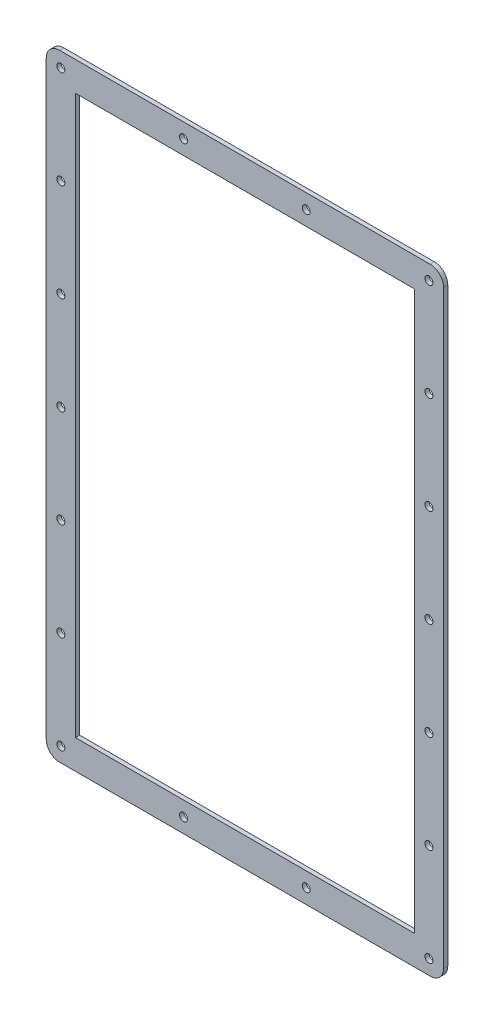
ISO-10303-21;
HEADER;
FILE_DESCRIPTION(('STEP AP214'),'2;1');
FILE_NAME('part.step','',(''),(''),'','','');
FILE_SCHEMA(('AUTOMOTIVE_DESIGN { 1 0 10303 214 1 1 1 1 }'));
ENDSEC;
DATA;
#1=APPLICATION_CONTEXT('core data for automotive mechanical design processes');
#2=APPLICATION_PROTOCOL_DEFINITION('international standard','automotive_design',2000,#1);
#3=PRODUCT_CONTEXT('',#1,'mechanical');
#4=PRODUCT('Part','Part','',(#3));
#5=PRODUCT_RELATED_PRODUCT_CATEGORY('part','',(#4));
#6=PRODUCT_DEFINITION_FORMATION('','',#4);
#7=PRODUCT_DEFINITION_CONTEXT('part definition',#1,'design');
#8=PRODUCT_DEFINITION('design','',#6,#7);
#9=PRODUCT_DEFINITION_SHAPE('','',#8);
#10=(LENGTH_UNIT() NAMED_UNIT(*) SI_UNIT(.MILLI.,.METRE.));
#11=(NAMED_UNIT(*) PLANE_ANGLE_UNIT() SI_UNIT($,.RADIAN.));
#12=(NAMED_UNIT(*) SI_UNIT($,.STERADIAN.) SOLID_ANGLE_UNIT());
#13=UNCERTAINTY_MEASURE_WITH_UNIT(LENGTH_MEASURE(1.E-05),#10,'distance_accuracy_value','');
#14=(GEOMETRIC_REPRESENTATION_CONTEXT(3) GLOBAL_UNCERTAINTY_ASSIGNED_CONTEXT((#13)) GLOBAL_UNIT_ASSIGNED_CONTEXT((#10,
#11,#12)) REPRESENTATION_CONTEXT('',''));
#15=CARTESIAN_POINT('',(0.,0.,0.));
#16=DIRECTION('',(0.,0.,1.));
#17=DIRECTION('',(1.,0.,0.));
#18=AXIS2_PLACEMENT_3D('',#15,#16,#17);
#19=CARTESIAN_POINT('',(139.5,222.,3.175));
#20=DIRECTION('',(0.,0.,1.));
#21=DIRECTION('',(1.,0.,0.));
#22=AXIS2_PLACEMENT_3D('',#19,#20,#21);
#23=PLANE('',#22);
#24=CARTESIAN_POINT('',(138.499999999996,-147.33333333332,3.175));
#25=DIRECTION('',(0.,0.,1.));
#26=DIRECTION('',(1.,0.,0.));
#27=AXIS2_PLACEMENT_3D('',#24,#25,#26);
#28=CIRCLE('',#27,2.99999999999999);
#29=CARTESIAN_POINT('',(141.499999999996,-147.33333333332,3.175));
#30=VERTEX_POINT('',#29);
#31=EDGE_CURVE('E419',#30,#30,#28,.T.);
#32=ORIENTED_EDGE('',*,*,#31,.F.);
#33=EDGE_LOOP('',(#32));
#34=FACE_BOUND('',#33,.T.);
#35=CARTESIAN_POINT('',(-46.166666666689,221.000000000004,3.175));
#36=DIRECTION('',(0.,0.,1.));
#37=DIRECTION('',(1.,0.,0.));
#38=AXIS2_PLACEMENT_3D('',#35,#36,#37);
#39=CIRCLE('',#38,3.);
#40=CARTESIAN_POINT('',(-43.166666666689,221.000000000004,3.175));
#41=VERTEX_POINT('',#40);
#42=EDGE_CURVE('E435',#41,#41,#39,.T.);
#43=ORIENTED_EDGE('',*,*,#42,.F.);
#44=EDGE_LOOP('',(#43));
#45=FACE_BOUND('',#44,.T.);
#46=CARTESIAN_POINT('',(-138.500000000016,73.6666666666667,3.175));
#47=DIRECTION('',(0.,0.,1.));
#48=DIRECTION('',(1.,0.,0.));
#49=AXIS2_PLACEMENT_3D('',#46,#47,#48);
#50=CIRCLE('',#49,2.99999999999999);
#51=CARTESIAN_POINT('',(-135.500000000016,73.6666666666667,3.175));
#52=VERTEX_POINT('',#51);
#53=EDGE_CURVE('E451',#52,#52,#50,.T.);
#54=ORIENTED_EDGE('',*,*,#53,.F.);
#55=EDGE_LOOP('',(#54));
#56=FACE_BOUND('',#55,.T.);
#57=CARTESIAN_POINT('',(138.499999999978,221.000000000013,3.175));
#58=DIRECTION('',(0.,0.,1.));
#59=DIRECTION('',(1.,0.,0.));
#60=AXIS2_PLACEMENT_3D('',#57,#58,#59);
#61=CIRCLE('',#60,2.99999999999999);
#62=CARTESIAN_POINT('',(141.499999999978,221.000000000013,3.175));
#63=VERTEX_POINT('',#62);
#64=EDGE_CURVE('E467',#63,#63,#61,.T.);
#65=ORIENTED_EDGE('',*,*,#64,.F.);
#66=EDGE_LOOP('',(#65));
#67=FACE_BOUND('',#66,.T.);
#68=CARTESIAN_POINT('',(138.499999999984,73.66666666668,3.175));
#69=DIRECTION('',(0.,0.,1.));
#70=DIRECTION('',(1.,0.,0.));
#71=AXIS2_PLACEMENT_3D('',#68,#69,#70);
#72=CIRCLE('',#71,2.99999999999999);
#73=CARTESIAN_POINT('',(141.499999999984,73.66666666668,3.175));
#74=VERTEX_POINT('',#73);
#75=EDGE_CURVE('E483',#74,#74,#72,.T.);
#76=ORIENTED_EDGE('',*,*,#75,.F.);
#77=EDGE_LOOP('',(#76));
#78=FACE_BOUND('',#77,.T.);
#79=CARTESIAN_POINT('',(138.499999999992,-73.6666666666533,3.175));
#80=DIRECTION('',(0.,0.,1.));
#81=DIRECTION('',(1.,0.,0.));
#82=AXIS2_PLACEMENT_3D('',#79,#80,#81);
#83=CIRCLE('',#82,2.99999999999999);
#84=CARTESIAN_POINT('',(141.499999999992,-73.6666666666533,3.175));
#85=VERTEX_POINT('',#84);
#86=EDGE_CURVE('E499',#85,#85,#83,.T.);
#87=ORIENTED_EDGE('',*,*,#86,.F.);
#88=EDGE_LOOP('',(#87));
#89=FACE_BOUND('',#88,.T.);
#90=CARTESIAN_POINT('',(-138.500000000008,-73.6666666666666,3.175));
#91=DIRECTION('',(0.,0.,1.));
#92=DIRECTION('',(1.,0.,0.));
#93=AXIS2_PLACEMENT_3D('',#90,#91,#92);
#94=CIRCLE('',#93,2.99999999999999);
#95=CARTESIAN_POINT('',(-135.500000000008,-73.6666666666666,3.175));
#96=VERTEX_POINT('',#95);
#97=EDGE_CURVE('E515',#96,#96,#94,.T.);
#98=ORIENTED_EDGE('',*,*,#97,.F.);
#99=EDGE_LOOP('',(#98));
#100=FACE_BOUND('',#99,.T.);
#101=CARTESIAN_POINT('',(-46.1666666666666,-220.999999999995,3.175));
#102=DIRECTION('',(0.,0.,1.));
#103=DIRECTION('',(1.,0.,0.));
#104=AXIS2_PLACEMENT_3D('',#101,#102,#103);
#105=CIRCLE('',#104,3.);
#106=CARTESIAN_POINT('',(-43.1666666666666,-220.999999999995,3.175));
#107=VERTEX_POINT('',#106);
#108=EDGE_CURVE('E531',#107,#107,#105,.T.);
#109=ORIENTED_EDGE('',*,*,#108,.F.);
#110=EDGE_LOOP('',(#109));
#111=FACE_BOUND('',#110,.T.);
#112=CARTESIAN_POINT('',(138.5,-220.999999999987,3.175));
#113=DIRECTION('',(0.,0.,1.));
#114=DIRECTION('',(1.,0.,0.));
#115=AXIS2_PLACEMENT_3D('',#112,#113,#114);
#116=CIRCLE('',#115,2.99999999999999);
#117=CARTESIAN_POINT('',(141.5,-220.999999999987,3.175));
#118=VERTEX_POINT('',#117);
#119=EDGE_CURVE('E164',#118,#118,#116,.T.);
#120=ORIENTED_EDGE('',*,*,#119,.F.);
#121=EDGE_LOOP('',(#120));
#122=FACE_BOUND('',#121,.T.);
#123=CARTESIAN_POINT('',(139.5,222.,3.175));
#124=DIRECTION('',(0.,0.,1.));
#125=DIRECTION('',(1.,0.,0.));
#126=AXIS2_PLACEMENT_3D('',#123,#124,#125);
#127=CIRCLE('',#126,10.);
#128=CARTESIAN_POINT('',(149.5,222.,3.175));
#129=VERTEX_POINT('',#128);
#130=CARTESIAN_POINT('',(139.5,232.,3.175));
#131=VERTEX_POINT('',#130);
#132=EDGE_CURVE('E180',#129,#131,#127,.T.);
#133=ORIENTED_EDGE('',*,*,#132,.T.);
#134=DIRECTION('',(-1.,0.,0.));
#135=VECTOR('',#134,1.);
#136=CARTESIAN_POINT('',(139.5,232.,3.175));
#137=LINE('',#136,#135);
#138=CARTESIAN_POINT('',(-139.5,232.,3.175));
#139=VERTEX_POINT('',#138);
#140=EDGE_CURVE('E184',#131,#139,#137,.T.);
#141=ORIENTED_EDGE('',*,*,#140,.T.);
#142=CARTESIAN_POINT('',(-139.5,222.,3.175));
#143=DIRECTION('',(0.,0.,1.));
#144=DIRECTION('',(1.,0.,0.));
#145=AXIS2_PLACEMENT_3D('',#142,#143,#144);
#146=CIRCLE('',#145,10.);
#147=CARTESIAN_POINT('',(-149.5,222.,3.175));
#148=VERTEX_POINT('',#147);
#149=EDGE_CURVE('E188',#139,#148,#146,.T.);
#150=ORIENTED_EDGE('',*,*,#149,.T.);
#151=DIRECTION('',(0.,-1.,0.));
#152=VECTOR('',#151,1.);
#153=CARTESIAN_POINT('',(-149.5,222.,3.175));
#154=LINE('',#153,#152);
#155=CARTESIAN_POINT('',(-149.5,-222.,3.175));
#156=VERTEX_POINT('',#155);
#157=EDGE_CURVE('E191',#148,#156,#154,.T.);
#158=ORIENTED_EDGE('',*,*,#157,.T.);
#159=CARTESIAN_POINT('',(-139.5,-222.,3.175));
#160=DIRECTION('',(0.,0.,1.));
#161=DIRECTION('',(1.,0.,0.));
#162=AXIS2_PLACEMENT_3D('',#159,#160,#161);
#163=CIRCLE('',#162,10.);
#164=CARTESIAN_POINT('',(-139.5,-232.,3.175));
#165=VERTEX_POINT('',#164);
#166=EDGE_CURVE('E194',#156,#165,#163,.T.);
#167=ORIENTED_EDGE('',*,*,#166,.T.);
#168=DIRECTION('',(1.,0.,0.));
#169=VECTOR('',#168,1.);
#170=CARTESIAN_POINT('',(-139.5,-232.,3.175));
#171=LINE('',#170,#169);
#172=CARTESIAN_POINT('',(139.5,-232.,3.175));
#173=VERTEX_POINT('',#172);
#174=EDGE_CURVE('E197',#165,#173,#171,.T.);
#175=ORIENTED_EDGE('',*,*,#174,.T.);
#176=CARTESIAN_POINT('',(139.5,-222.,3.175));
#177=DIRECTION('',(0.,0.,1.));
#178=DIRECTION('',(1.,0.,0.));
#179=AXIS2_PLACEMENT_3D('',#176,#177,#178);
#180=CIRCLE('',#179,10.);
#181=CARTESIAN_POINT('',(149.5,-222.,3.175));
#182=VERTEX_POINT('',#181);
#183=EDGE_CURVE('E200',#173,#182,#180,.T.);
#184=ORIENTED_EDGE('',*,*,#183,.T.);
#185=DIRECTION('',(0.,1.,0.));
#186=VECTOR('',#185,1.);
#187=CARTESIAN_POINT('',(149.5,-222.,3.175));
#188=LINE('',#187,#186);
#189=EDGE_CURVE('E203',#182,#129,#188,.T.);
#190=ORIENTED_EDGE('',*,*,#189,.T.);
#191=EDGE_LOOP('',(#133,#141,#150,#158,#167,#175,#184,#190));
#192=FACE_BOUND('',#191,.T.);
#193=DIRECTION('',(-1.,0.,0.));
#194=VECTOR('',#193,1.);
#195=CARTESIAN_POINT('',(127.5,210.,3.175));
#196=LINE('',#195,#194);
#197=CARTESIAN_POINT('',(127.5,210.,3.175));
#198=VERTEX_POINT('',#197);
#199=CARTESIAN_POINT('',(-127.5,210.,3.175));
#200=VERTEX_POINT('',#199);
#201=EDGE_CURVE('E138',#198,#200,#196,.T.);
#202=ORIENTED_EDGE('',*,*,#201,.F.);
#203=DIRECTION('',(0.,1.,0.));
#204=VECTOR('',#203,1.);
#205=CARTESIAN_POINT('',(127.5,-210.,3.175));
#206=LINE('',#205,#204);
#207=CARTESIAN_POINT('',(127.5,-210.,3.175));
#208=VERTEX_POINT('',#207);
#209=EDGE_CURVE('E129',#208,#198,#206,.T.);
#210=ORIENTED_EDGE('',*,*,#209,.F.);
#211=DIRECTION('',(1.,0.,0.));
#212=VECTOR('',#211,1.);
#213=CARTESIAN_POINT('',(-127.5,-210.,3.175));
#214=LINE('',#213,#212);
#215=CARTESIAN_POINT('',(-127.5,-210.,3.175));
#216=VERTEX_POINT('',#215);
#217=EDGE_CURVE('E156',#216,#208,#214,.T.);
#218=ORIENTED_EDGE('',*,*,#217,.F.);
#219=DIRECTION('',(0.,-1.,0.));
#220=VECTOR('',#219,1.);
#221=CARTESIAN_POINT('',(-127.5,210.,3.175));
#222=LINE('',#221,#220);
#223=EDGE_CURVE('E152',#200,#216,#222,.T.);
#224=ORIENTED_EDGE('',*,*,#223,.F.);
#225=EDGE_LOOP('',(#202,#210,#218,#224));
#226=FACE_BOUND('',#225,.T.);
#227=CARTESIAN_POINT('',(46.1666666666667,-220.999999999991,3.175));
#228=DIRECTION('',(0.,0.,1.));
#229=DIRECTION('',(1.,0.,0.));
#230=AXIS2_PLACEMENT_3D('',#227,#228,#229);
#231=CIRCLE('',#230,3.);
#232=CARTESIAN_POINT('',(49.1666666666667,-220.999999999991,3.175));
#233=VERTEX_POINT('',#232);
#234=EDGE_CURVE('E539',#233,#233,#231,.T.);
#235=ORIENTED_EDGE('',*,*,#234,.F.);
#236=EDGE_LOOP('',(#235));
#237=FACE_BOUND('',#236,.T.);
#238=CARTESIAN_POINT('',(-138.5,-221.,3.175));
#239=DIRECTION('',(0.,0.,1.));
#240=DIRECTION('',(1.,0.,0.));
#241=AXIS2_PLACEMENT_3D('',#238,#239,#240);
#242=CIRCLE('',#241,2.99999999999999);
#243=CARTESIAN_POINT('',(-135.5,-221.,3.175));
#244=VERTEX_POINT('',#243);
#245=EDGE_CURVE('E523',#244,#244,#242,.T.);
#246=ORIENTED_EDGE('',*,*,#245,.F.);
#247=EDGE_LOOP('',(#246));
#248=FACE_BOUND('',#247,.T.);
#249=CARTESIAN_POINT('',(-138.500000000012,0.,3.175));
#250=DIRECTION('',(0.,0.,1.));
#251=DIRECTION('',(1.,0.,0.));
#252=AXIS2_PLACEMENT_3D('',#249,#250,#251);
#253=CIRCLE('',#252,2.99999999999999);
#254=CARTESIAN_POINT('',(-135.500000000012,0.,3.175));
#255=VERTEX_POINT('',#254);
#256=EDGE_CURVE('E507',#255,#255,#253,.T.);
#257=ORIENTED_EDGE('',*,*,#256,.F.);
#258=EDGE_LOOP('',(#257));
#259=FACE_BOUND('',#258,.T.);
#260=CARTESIAN_POINT('',(138.499999999988,1.34336985979644E-11,3.175));
#261=DIRECTION('',(0.,0.,1.));
#262=DIRECTION('',(1.,0.,0.));
#263=AXIS2_PLACEMENT_3D('',#260,#261,#262);
#264=CIRCLE('',#263,2.99999999999999);
#265=CARTESIAN_POINT('',(141.499999999988,1.34336985979644E-11,3.175));
#266=VERTEX_POINT('',#265);
#267=EDGE_CURVE('E491',#266,#266,#264,.T.);
#268=ORIENTED_EDGE('',*,*,#267,.F.);
#269=EDGE_LOOP('',(#268));
#270=FACE_BOUND('',#269,.T.);
#271=CARTESIAN_POINT('',(138.499999999981,147.333333333347,3.175));
#272=DIRECTION('',(0.,0.,1.));
#273=DIRECTION('',(1.,0.,0.));
#274=AXIS2_PLACEMENT_3D('',#271,#272,#273);
#275=CIRCLE('',#274,2.99999999999999);
#276=CARTESIAN_POINT('',(141.499999999981,147.333333333347,3.175));
#277=VERTEX_POINT('',#276);
#278=EDGE_CURVE('E475',#277,#277,#275,.T.);
#279=ORIENTED_EDGE('',*,*,#278,.F.);
#280=EDGE_LOOP('',(#279));
#281=FACE_BOUND('',#280,.T.);
#282=CARTESIAN_POINT('',(46.1666666666443,221.000000000009,3.175));
#283=DIRECTION('',(0.,0.,1.));
#284=DIRECTION('',(1.,0.,0.));
#285=AXIS2_PLACEMENT_3D('',#282,#283,#284);
#286=CIRCLE('',#285,3.);
#287=CARTESIAN_POINT('',(49.1666666666443,221.000000000009,3.175));
#288=VERTEX_POINT('',#287);
#289=EDGE_CURVE('E459',#288,#288,#286,.T.);
#290=ORIENTED_EDGE('',*,*,#289,.F.);
#291=EDGE_LOOP('',(#290));
#292=FACE_BOUND('',#291,.T.);
#293=CARTESIAN_POINT('',(-138.500000000019,147.333333333333,3.175));
#294=DIRECTION('',(0.,0.,1.));
#295=DIRECTION('',(1.,0.,0.));
#296=AXIS2_PLACEMENT_3D('',#293,#294,#295);
#297=CIRCLE('',#296,2.99999999999999);
#298=CARTESIAN_POINT('',(-135.500000000019,147.333333333333,3.175));
#299=VERTEX_POINT('',#298);
#300=EDGE_CURVE('E443',#299,#299,#297,.T.);
#301=ORIENTED_EDGE('',*,*,#300,.F.);
#302=EDGE_LOOP('',(#301));
#303=FACE_BOUND('',#302,.T.);
#304=CARTESIAN_POINT('',(-138.500000000022,221.,3.175));
#305=DIRECTION('',(0.,0.,1.));
#306=DIRECTION('',(1.,0.,0.));
#307=AXIS2_PLACEMENT_3D('',#304,#305,#306);
#308=CIRCLE('',#307,3.00000000000516);
#309=CARTESIAN_POINT('',(-135.500000000017,221.,3.175));
#310=VERTEX_POINT('',#309);
#311=EDGE_CURVE('E427',#310,#310,#308,.T.);
#312=ORIENTED_EDGE('',*,*,#311,.F.);
#313=EDGE_LOOP('',(#312));
#314=FACE_BOUND('',#313,.T.);
#315=CARTESIAN_POINT('',(-138.500000000004,-147.333333333333,3.175));
#316=DIRECTION('',(0.,0.,1.));
#317=DIRECTION('',(1.,0.,0.));
#318=AXIS2_PLACEMENT_3D('',#315,#316,#317);
#319=CIRCLE('',#318,2.99999999999999);
#320=CARTESIAN_POINT('',(-135.500000000004,-147.333333333333,3.175));
#321=VERTEX_POINT('',#320);
#322=EDGE_CURVE('E408',#321,#321,#319,.T.);
#323=ORIENTED_EDGE('',*,*,#322,.F.);
#324=EDGE_LOOP('',(#323));
#325=FACE_BOUND('',#324,.T.);
#326=ADVANCED_FACE('F39',(#34,#45,#56,#67,#78,#89,#100,#111,#122,#192,#226,#237,#248,#259,#270,
#281,#292,#303,#314,#325),#23,.T.);
#327=CARTESIAN_POINT('',(139.5,222.,0.));
#328=DIRECTION('',(0.,0.,1.));
#329=DIRECTION('',(1.,0.,0.));
#330=AXIS2_PLACEMENT_3D('',#327,#328,#329);
#331=PLANE('',#330);
#332=CARTESIAN_POINT('',(139.5,222.,0.));
#333=DIRECTION('',(0.,0.,1.));
#334=DIRECTION('',(1.,0.,0.));
#335=AXIS2_PLACEMENT_3D('',#332,#333,#334);
#336=CIRCLE('',#335,10.);
#337=CARTESIAN_POINT('',(149.5,222.,0.));
#338=VERTEX_POINT('',#337);
#339=CARTESIAN_POINT('',(139.5,232.,0.));
#340=VERTEX_POINT('',#339);
#341=EDGE_CURVE('E147',#338,#340,#336,.T.);
#342=ORIENTED_EDGE('',*,*,#341,.F.);
#343=DIRECTION('',(0.,1.,0.));
#344=VECTOR('',#343,1.);
#345=CARTESIAN_POINT('',(149.5,-222.,0.));
#346=LINE('',#345,#344);
#347=CARTESIAN_POINT('',(149.5,-222.,0.));
#348=VERTEX_POINT('',#347);
#349=EDGE_CURVE('E185',#348,#338,#346,.T.);
#350=ORIENTED_EDGE('',*,*,#349,.F.);
#351=CARTESIAN_POINT('',(139.5,-222.,0.));
#352=DIRECTION('',(0.,0.,1.));
#353=DIRECTION('',(1.,0.,0.));
#354=AXIS2_PLACEMENT_3D('',#351,#352,#353);
#355=CIRCLE('',#354,10.);
#356=CARTESIAN_POINT('',(139.5,-232.,0.));
#357=VERTEX_POINT('',#356);
#358=EDGE_CURVE('E225',#357,#348,#355,.T.);
#359=ORIENTED_EDGE('',*,*,#358,.F.);
#360=DIRECTION('',(1.,0.,0.));
#361=VECTOR('',#360,1.);
#362=CARTESIAN_POINT('',(-139.5,-232.,0.));
#363=LINE('',#362,#361);
#364=CARTESIAN_POINT('',(-139.5,-232.,0.));
#365=VERTEX_POINT('',#364);
#366=EDGE_CURVE('E222',#365,#357,#363,.T.);
#367=ORIENTED_EDGE('',*,*,#366,.F.);
#368=CARTESIAN_POINT('',(-139.5,-222.,0.));
#369=DIRECTION('',(0.,0.,1.));
#370=DIRECTION('',(1.,0.,0.));
#371=AXIS2_PLACEMENT_3D('',#368,#369,#370);
#372=CIRCLE('',#371,10.);
#373=CARTESIAN_POINT('',(-149.5,-222.,0.));
#374=VERTEX_POINT('',#373);
#375=EDGE_CURVE('E219',#374,#365,#372,.T.);
#376=ORIENTED_EDGE('',*,*,#375,.F.);
#377=DIRECTION('',(0.,-1.,0.));
#378=VECTOR('',#377,1.);
#379=CARTESIAN_POINT('',(-149.5,222.,0.));
#380=LINE('',#379,#378);
#381=CARTESIAN_POINT('',(-149.5,222.,0.));
#382=VERTEX_POINT('',#381);
#383=EDGE_CURVE('E216',#382,#374,#380,.T.);
#384=ORIENTED_EDGE('',*,*,#383,.F.);
#385=CARTESIAN_POINT('',(-139.5,222.,0.));
#386=DIRECTION('',(0.,0.,1.));
#387=DIRECTION('',(1.,0.,0.));
#388=AXIS2_PLACEMENT_3D('',#385,#386,#387);
#389=CIRCLE('',#388,10.);
#390=CARTESIAN_POINT('',(-139.5,232.,0.));
#391=VERTEX_POINT('',#390);
#392=EDGE_CURVE('E213',#391,#382,#389,.T.);
#393=ORIENTED_EDGE('',*,*,#392,.F.);
#394=DIRECTION('',(-1.,0.,0.));
#395=VECTOR('',#394,1.);
#396=CARTESIAN_POINT('',(139.5,232.,0.));
#397=LINE('',#396,#395);
#398=EDGE_CURVE('E210',#340,#391,#397,.T.);
#399=ORIENTED_EDGE('',*,*,#398,.F.);
#400=EDGE_LOOP('',(#342,#350,#359,#367,#376,#384,#393,#399));
#401=FACE_BOUND('',#400,.T.);
#402=DIRECTION('',(0.,1.,0.));
#403=VECTOR('',#402,1.);
#404=CARTESIAN_POINT('',(127.5,-210.,0.));
#405=LINE('',#404,#403);
#406=CARTESIAN_POINT('',(127.5,-210.,0.));
#407=VERTEX_POINT('',#406);
#408=CARTESIAN_POINT('',(127.5,210.,0.));
#409=VERTEX_POINT('',#408);
#410=EDGE_CURVE('E63',#407,#409,#405,.T.);
#411=ORIENTED_EDGE('',*,*,#410,.T.);
#412=DIRECTION('',(-1.,0.,0.));
#413=VECTOR('',#412,1.);
#414=CARTESIAN_POINT('',(127.5,210.,0.));
#415=LINE('',#414,#413);
#416=CARTESIAN_POINT('',(-127.5,210.,0.));
#417=VERTEX_POINT('',#416);
#418=EDGE_CURVE('E145',#409,#417,#415,.T.);
#419=ORIENTED_EDGE('',*,*,#418,.T.);
#420=DIRECTION('',(0.,-1.,0.));
#421=VECTOR('',#420,1.);
#422=CARTESIAN_POINT('',(-127.5,210.,0.));
#423=LINE('',#422,#421);
#424=CARTESIAN_POINT('',(-127.5,-210.,0.));
#425=VERTEX_POINT('',#424);
#426=EDGE_CURVE('E167',#417,#425,#423,.T.);
#427=ORIENTED_EDGE('',*,*,#426,.T.);
#428=DIRECTION('',(1.,0.,0.));
#429=VECTOR('',#428,1.);
#430=CARTESIAN_POINT('',(-127.5,-210.,0.));
#431=LINE('',#430,#429);
#432=EDGE_CURVE('E139',#425,#407,#431,.T.);
#433=ORIENTED_EDGE('',*,*,#432,.T.);
#434=EDGE_LOOP('',(#411,#419,#427,#433));
#435=FACE_BOUND('',#434,.T.);
#436=CARTESIAN_POINT('',(138.5,-220.999999999987,0.));
#437=DIRECTION('',(0.,0.,1.));
#438=DIRECTION('',(1.,0.,0.));
#439=AXIS2_PLACEMENT_3D('',#436,#437,#438);
#440=CIRCLE('',#439,2.99999999999999);
#441=CARTESIAN_POINT('',(141.5,-220.999999999987,0.));
#442=VERTEX_POINT('',#441);
#443=EDGE_CURVE('E543',#442,#442,#440,.T.);
#444=ORIENTED_EDGE('',*,*,#443,.T.);
#445=EDGE_LOOP('',(#444));
#446=FACE_BOUND('',#445,.T.);
#447=CARTESIAN_POINT('',(46.1666666666667,-220.999999999991,0.));
#448=DIRECTION('',(0.,0.,1.));
#449=DIRECTION('',(1.,0.,0.));
#450=AXIS2_PLACEMENT_3D('',#447,#448,#449);
#451=CIRCLE('',#450,3.);
#452=CARTESIAN_POINT('',(49.1666666666667,-220.999999999991,0.));
#453=VERTEX_POINT('',#452);
#454=EDGE_CURVE('E535',#453,#453,#451,.T.);
#455=ORIENTED_EDGE('',*,*,#454,.T.);
#456=EDGE_LOOP('',(#455));
#457=FACE_BOUND('',#456,.T.);
#458=CARTESIAN_POINT('',(-46.1666666666666,-220.999999999995,0.));
#459=DIRECTION('',(0.,0.,1.));
#460=DIRECTION('',(1.,0.,0.));
#461=AXIS2_PLACEMENT_3D('',#458,#459,#460);
#462=CIRCLE('',#461,3.);
#463=CARTESIAN_POINT('',(-43.1666666666666,-220.999999999995,0.));
#464=VERTEX_POINT('',#463);
#465=EDGE_CURVE('E527',#464,#464,#462,.T.);
#466=ORIENTED_EDGE('',*,*,#465,.T.);
#467=EDGE_LOOP('',(#466));
#468=FACE_BOUND('',#467,.T.);
#469=CARTESIAN_POINT('',(-138.5,-221.,0.));
#470=DIRECTION('',(0.,0.,1.));
#471=DIRECTION('',(1.,0.,0.));
#472=AXIS2_PLACEMENT_3D('',#469,#470,#471);
#473=CIRCLE('',#472,2.99999999999999);
#474=CARTESIAN_POINT('',(-135.5,-221.,0.));
#475=VERTEX_POINT('',#474);
#476=EDGE_CURVE('E519',#475,#475,#473,.T.);
#477=ORIENTED_EDGE('',*,*,#476,.T.);
#478=EDGE_LOOP('',(#477));
#479=FACE_BOUND('',#478,.T.);
#480=CARTESIAN_POINT('',(-138.500000000008,-73.6666666666666,0.));
#481=DIRECTION('',(0.,0.,1.));
#482=DIRECTION('',(1.,0.,0.));
#483=AXIS2_PLACEMENT_3D('',#480,#481,#482);
#484=CIRCLE('',#483,2.99999999999999);
#485=CARTESIAN_POINT('',(-135.500000000008,-73.6666666666666,0.));
#486=VERTEX_POINT('',#485);
#487=EDGE_CURVE('E511',#486,#486,#484,.T.);
#488=ORIENTED_EDGE('',*,*,#487,.T.);
#489=EDGE_LOOP('',(#488));
#490=FACE_BOUND('',#489,.T.);
#491=CARTESIAN_POINT('',(-138.500000000012,0.,0.));
#492=DIRECTION('',(0.,0.,1.));
#493=DIRECTION('',(1.,0.,0.));
#494=AXIS2_PLACEMENT_3D('',#491,#492,#493);
#495=CIRCLE('',#494,2.99999999999999);
#496=CARTESIAN_POINT('',(-135.500000000012,0.,0.));
#497=VERTEX_POINT('',#496);
#498=EDGE_CURVE('E503',#497,#497,#495,.T.);
#499=ORIENTED_EDGE('',*,*,#498,.T.);
#500=EDGE_LOOP('',(#499));
#501=FACE_BOUND('',#500,.T.);
#502=CARTESIAN_POINT('',(138.499999999992,-73.6666666666533,0.));
#503=DIRECTION('',(0.,0.,1.));
#504=DIRECTION('',(1.,0.,0.));
#505=AXIS2_PLACEMENT_3D('',#502,#503,#504);
#506=CIRCLE('',#505,2.99999999999999);
#507=CARTESIAN_POINT('',(141.499999999992,-73.6666666666533,0.));
#508=VERTEX_POINT('',#507);
#509=EDGE_CURVE('E495',#508,#508,#506,.T.);
#510=ORIENTED_EDGE('',*,*,#509,.T.);
#511=EDGE_LOOP('',(#510));
#512=FACE_BOUND('',#511,.T.);
#513=CARTESIAN_POINT('',(138.499999999988,1.34336985979644E-11,0.));
#514=DIRECTION('',(0.,0.,1.));
#515=DIRECTION('',(1.,0.,0.));
#516=AXIS2_PLACEMENT_3D('',#513,#514,#515);
#517=CIRCLE('',#516,2.99999999999999);
#518=CARTESIAN_POINT('',(141.499999999988,1.34336985979644E-11,0.));
#519=VERTEX_POINT('',#518);
#520=EDGE_CURVE('E487',#519,#519,#517,.T.);
#521=ORIENTED_EDGE('',*,*,#520,.T.);
#522=EDGE_LOOP('',(#521));
#523=FACE_BOUND('',#522,.T.);
#524=CARTESIAN_POINT('',(138.499999999984,73.66666666668,0.));
#525=DIRECTION('',(0.,0.,1.));
#526=DIRECTION('',(1.,0.,0.));
#527=AXIS2_PLACEMENT_3D('',#524,#525,#526);
#528=CIRCLE('',#527,2.99999999999999);
#529=CARTESIAN_POINT('',(141.499999999984,73.66666666668,0.));
#530=VERTEX_POINT('',#529);
#531=EDGE_CURVE('E479',#530,#530,#528,.T.);
#532=ORIENTED_EDGE('',*,*,#531,.T.);
#533=EDGE_LOOP('',(#532));
#534=FACE_BOUND('',#533,.T.);
#535=CARTESIAN_POINT('',(138.499999999981,147.333333333347,0.));
#536=DIRECTION('',(0.,0.,1.));
#537=DIRECTION('',(1.,0.,0.));
#538=AXIS2_PLACEMENT_3D('',#535,#536,#537);
#539=CIRCLE('',#538,2.99999999999999);
#540=CARTESIAN_POINT('',(141.499999999981,147.333333333347,0.));
#541=VERTEX_POINT('',#540);
#542=EDGE_CURVE('E471',#541,#541,#539,.T.);
#543=ORIENTED_EDGE('',*,*,#542,.T.);
#544=EDGE_LOOP('',(#543));
#545=FACE_BOUND('',#544,.T.);
#546=CARTESIAN_POINT('',(138.499999999978,221.000000000013,0.));
#547=DIRECTION('',(0.,0.,1.));
#548=DIRECTION('',(1.,0.,0.));
#549=AXIS2_PLACEMENT_3D('',#546,#547,#548);
#550=CIRCLE('',#549,2.99999999999999);
#551=CARTESIAN_POINT('',(141.499999999978,221.000000000013,0.));
#552=VERTEX_POINT('',#551);
#553=EDGE_CURVE('E463',#552,#552,#550,.T.);
#554=ORIENTED_EDGE('',*,*,#553,.T.);
#555=EDGE_LOOP('',(#554));
#556=FACE_BOUND('',#555,.T.);
#557=CARTESIAN_POINT('',(46.1666666666443,221.000000000009,0.));
#558=DIRECTION('',(0.,0.,1.));
#559=DIRECTION('',(1.,0.,0.));
#560=AXIS2_PLACEMENT_3D('',#557,#558,#559);
#561=CIRCLE('',#560,3.);
#562=CARTESIAN_POINT('',(49.1666666666443,221.000000000009,0.));
#563=VERTEX_POINT('',#562);
#564=EDGE_CURVE('E455',#563,#563,#561,.T.);
#565=ORIENTED_EDGE('',*,*,#564,.T.);
#566=EDGE_LOOP('',(#565));
#567=FACE_BOUND('',#566,.T.);
#568=CARTESIAN_POINT('',(-138.500000000016,73.6666666666667,0.));
#569=DIRECTION('',(0.,0.,1.));
#570=DIRECTION('',(1.,0.,0.));
#571=AXIS2_PLACEMENT_3D('',#568,#569,#570);
#572=CIRCLE('',#571,2.99999999999999);
#573=CARTESIAN_POINT('',(-135.500000000016,73.6666666666667,0.));
#574=VERTEX_POINT('',#573);
#575=EDGE_CURVE('E447',#574,#574,#572,.T.);
#576=ORIENTED_EDGE('',*,*,#575,.T.);
#577=EDGE_LOOP('',(#576));
#578=FACE_BOUND('',#577,.T.);
#579=CARTESIAN_POINT('',(-138.500000000019,147.333333333333,0.));
#580=DIRECTION('',(0.,0.,1.));
#581=DIRECTION('',(1.,0.,0.));
#582=AXIS2_PLACEMENT_3D('',#579,#580,#581);
#583=CIRCLE('',#582,2.99999999999999);
#584=CARTESIAN_POINT('',(-135.500000000019,147.333333333333,0.));
#585=VERTEX_POINT('',#584);
#586=EDGE_CURVE('E439',#585,#585,#583,.T.);
#587=ORIENTED_EDGE('',*,*,#586,.T.);
#588=EDGE_LOOP('',(#587));
#589=FACE_BOUND('',#588,.T.);
#590=CARTESIAN_POINT('',(-46.166666666689,221.000000000004,0.));
#591=DIRECTION('',(0.,0.,1.));
#592=DIRECTION('',(1.,0.,0.));
#593=AXIS2_PLACEMENT_3D('',#590,#591,#592);
#594=CIRCLE('',#593,3.);
#595=CARTESIAN_POINT('',(-43.166666666689,221.000000000004,0.));
#596=VERTEX_POINT('',#595);
#597=EDGE_CURVE('E431',#596,#596,#594,.T.);
#598=ORIENTED_EDGE('',*,*,#597,.T.);
#599=EDGE_LOOP('',(#598));
#600=FACE_BOUND('',#599,.T.);
#601=CARTESIAN_POINT('',(-138.500000000022,221.,0.));
#602=DIRECTION('',(0.,0.,1.));
#603=DIRECTION('',(1.,0.,0.));
#604=AXIS2_PLACEMENT_3D('',#601,#602,#603);
#605=CIRCLE('',#604,3.00000000000516);
#606=CARTESIAN_POINT('',(-135.500000000017,221.,0.));
#607=VERTEX_POINT('',#606);
#608=EDGE_CURVE('E423',#607,#607,#605,.T.);
#609=ORIENTED_EDGE('',*,*,#608,.T.);
#610=EDGE_LOOP('',(#609));
#611=FACE_BOUND('',#610,.T.);
#612=CARTESIAN_POINT('',(138.499999999996,-147.33333333332,0.));
#613=DIRECTION('',(0.,0.,1.));
#614=DIRECTION('',(1.,0.,0.));
#615=AXIS2_PLACEMENT_3D('',#612,#613,#614);
#616=CIRCLE('',#615,2.99999999999999);
#617=CARTESIAN_POINT('',(141.499999999996,-147.33333333332,0.));
#618=VERTEX_POINT('',#617);
#619=EDGE_CURVE('E416',#618,#618,#616,.T.);
#620=ORIENTED_EDGE('',*,*,#619,.T.);
#621=EDGE_LOOP('',(#620));
#622=FACE_BOUND('',#621,.T.);
#623=CARTESIAN_POINT('',(-138.500000000004,-147.333333333333,0.));
#624=DIRECTION('',(0.,0.,1.));
#625=DIRECTION('',(1.,0.,0.));
#626=AXIS2_PLACEMENT_3D('',#623,#624,#625);
#627=CIRCLE('',#626,2.99999999999999);
#628=CARTESIAN_POINT('',(-135.500000000004,-147.333333333333,0.));
#629=VERTEX_POINT('',#628);
#630=EDGE_CURVE('E411',#629,#629,#627,.T.);
#631=ORIENTED_EDGE('',*,*,#630,.T.);
#632=EDGE_LOOP('',(#631));
#633=FACE_BOUND('',#632,.T.);
#634=ADVANCED_FACE('F264',(#401,#435,#446,#457,#468,#479,#490,#501,#512,#523,#534,#545,#556,
#567,#578,#589,#600,#611,#622,#633),#331,.F.);
#635=CARTESIAN_POINT('',(139.5,222.,3.175));
#636=DIRECTION('',(0.,0.,-1.));
#637=DIRECTION('',(-1.,0.,0.));
#638=AXIS2_PLACEMENT_3D('',#635,#636,#637);
#639=CYLINDRICAL_SURFACE('',#638,10.);
#640=ORIENTED_EDGE('',*,*,#341,.T.);
#641=DIRECTION('',(0.,0.,-1.));
#642=VECTOR('',#641,1.);
#643=CARTESIAN_POINT('',(139.5,232.,3.175));
#644=LINE('',#643,#642);
#645=EDGE_CURVE('E11',#131,#340,#644,.T.);
#646=ORIENTED_EDGE('',*,*,#645,.F.);
#647=ORIENTED_EDGE('',*,*,#132,.F.);
#648=DIRECTION('',(0.,0.,-1.));
#649=VECTOR('',#648,1.);
#650=CARTESIAN_POINT('',(149.5,222.,3.175));
#651=LINE('',#650,#649);
#652=EDGE_CURVE('E206',#129,#338,#651,.T.);
#653=ORIENTED_EDGE('',*,*,#652,.T.);
#654=EDGE_LOOP('',(#640,#646,#647,#653));
#655=FACE_BOUND('',#654,.T.);
#656=ADVANCED_FACE('F41',(#655),#639,.T.);
#657=CARTESIAN_POINT('',(139.5,232.,3.175));
#658=DIRECTION('',(0.,-1.,0.));
#659=DIRECTION('',(1.,0.,0.));
#660=AXIS2_PLACEMENT_3D('',#657,#658,#659);
#661=PLANE('',#660);
#662=ORIENTED_EDGE('',*,*,#398,.T.);
#663=DIRECTION('',(0.,0.,-1.));
#664=VECTOR('',#663,1.);
#665=CARTESIAN_POINT('',(-139.5,232.,3.175));
#666=LINE('',#665,#664);
#667=EDGE_CURVE('E48',#139,#391,#666,.T.);
#668=ORIENTED_EDGE('',*,*,#667,.F.);
#669=ORIENTED_EDGE('',*,*,#140,.F.);
#670=ORIENTED_EDGE('',*,*,#645,.T.);
#671=EDGE_LOOP('',(#662,#668,#669,#670));
#672=FACE_BOUND('',#671,.T.);
#673=ADVANCED_FACE('F281',(#672),#661,.F.);
#674=CARTESIAN_POINT('',(-139.5,222.,3.175));
#675=DIRECTION('',(0.,0.,-1.));
#676=DIRECTION('',(-1.,0.,0.));
#677=AXIS2_PLACEMENT_3D('',#674,#675,#676);
#678=CYLINDRICAL_SURFACE('',#677,10.);
#679=ORIENTED_EDGE('',*,*,#392,.T.);
#680=DIRECTION('',(0.,0.,-1.));
#681=VECTOR('',#680,1.);
#682=CARTESIAN_POINT('',(-149.5,222.,3.175));
#683=LINE('',#682,#681);
#684=EDGE_CURVE('E249',#148,#382,#683,.T.);
#685=ORIENTED_EDGE('',*,*,#684,.F.);
#686=ORIENTED_EDGE('',*,*,#149,.F.);
#687=ORIENTED_EDGE('',*,*,#667,.T.);
#688=EDGE_LOOP('',(#679,#685,#686,#687));
#689=FACE_BOUND('',#688,.T.);
#690=ADVANCED_FACE('F258',(#689),#678,.T.);
#691=CARTESIAN_POINT('',(-149.5,222.,3.175));
#692=DIRECTION('',(1.,0.,0.));
#693=DIRECTION('',(0.,1.,0.));
#694=AXIS2_PLACEMENT_3D('',#691,#692,#693);
#695=PLANE('',#694);
#696=ORIENTED_EDGE('',*,*,#383,.T.);
#697=DIRECTION('',(0.,0.,-1.));
#698=VECTOR('',#697,1.);
#699=CARTESIAN_POINT('',(-149.5,-222.,3.175));
#700=LINE('',#699,#698);
#701=EDGE_CURVE('E245',#156,#374,#700,.T.);
#702=ORIENTED_EDGE('',*,*,#701,.F.);
#703=ORIENTED_EDGE('',*,*,#157,.F.);
#704=ORIENTED_EDGE('',*,*,#684,.T.);
#705=EDGE_LOOP('',(#696,#702,#703,#704));
#706=FACE_BOUND('',#705,.T.);
#707=ADVANCED_FACE('F270',(#706),#695,.F.);
#708=CARTESIAN_POINT('',(-139.5,-222.,3.175));
#709=DIRECTION('',(0.,0.,-1.));
#710=DIRECTION('',(-1.,0.,0.));
#711=AXIS2_PLACEMENT_3D('',#708,#709,#710);
#712=CYLINDRICAL_SURFACE('',#711,10.);
#713=ORIENTED_EDGE('',*,*,#375,.T.);
#714=DIRECTION('',(0.,0.,-1.));
#715=VECTOR('',#714,1.);
#716=CARTESIAN_POINT('',(-139.5,-232.,3.175));
#717=LINE('',#716,#715);
#718=EDGE_CURVE('E241',#165,#365,#717,.T.);
#719=ORIENTED_EDGE('',*,*,#718,.F.);
#720=ORIENTED_EDGE('',*,*,#166,.F.);
#721=ORIENTED_EDGE('',*,*,#701,.T.);
#722=EDGE_LOOP('',(#713,#719,#720,#721));
#723=FACE_BOUND('',#722,.T.);
#724=ADVANCED_FACE('F274',(#723),#712,.T.);
#725=CARTESIAN_POINT('',(-139.5,-232.,3.175));
#726=DIRECTION('',(0.,1.,0.));
#727=DIRECTION('',(0.,0.,1.));
#728=AXIS2_PLACEMENT_3D('',#725,#726,#727);
#729=PLANE('',#728);
#730=ORIENTED_EDGE('',*,*,#366,.T.);
#731=DIRECTION('',(0.,0.,-1.));
#732=VECTOR('',#731,1.);
#733=CARTESIAN_POINT('',(139.5,-232.,3.175));
#734=LINE('',#733,#732);
#735=EDGE_CURVE('E237',#173,#357,#734,.T.);
#736=ORIENTED_EDGE('',*,*,#735,.F.);
#737=ORIENTED_EDGE('',*,*,#174,.F.);
#738=ORIENTED_EDGE('',*,*,#718,.T.);
#739=EDGE_LOOP('',(#730,#736,#737,#738));
#740=FACE_BOUND('',#739,.T.);
#741=ADVANCED_FACE('F294',(#740),#729,.F.);
#742=CARTESIAN_POINT('',(139.5,-222.,3.175));
#743=DIRECTION('',(0.,0.,-1.));
#744=DIRECTION('',(-1.,0.,0.));
#745=AXIS2_PLACEMENT_3D('',#742,#743,#744);
#746=CYLINDRICAL_SURFACE('',#745,10.);
#747=ORIENTED_EDGE('',*,*,#358,.T.);
#748=DIRECTION('',(0.,0.,-1.));
#749=VECTOR('',#748,1.);
#750=CARTESIAN_POINT('',(149.5,-222.,3.175));
#751=LINE('',#750,#749);
#752=EDGE_CURVE('E233',#182,#348,#751,.T.);
#753=ORIENTED_EDGE('',*,*,#752,.F.);
#754=ORIENTED_EDGE('',*,*,#183,.F.);
#755=ORIENTED_EDGE('',*,*,#735,.T.);
#756=EDGE_LOOP('',(#747,#753,#754,#755));
#757=FACE_BOUND('',#756,.T.);
#758=ADVANCED_FACE('F292',(#757),#746,.T.);
#759=CARTESIAN_POINT('',(149.5,-222.,3.175));
#760=DIRECTION('',(-1.,0.,0.));
#761=DIRECTION('',(0.,-1.,0.));
#762=AXIS2_PLACEMENT_3D('',#759,#760,#761);
#763=PLANE('',#762);
#764=ORIENTED_EDGE('',*,*,#349,.T.);
#765=ORIENTED_EDGE('',*,*,#652,.F.);
#766=ORIENTED_EDGE('',*,*,#189,.F.);
#767=ORIENTED_EDGE('',*,*,#752,.T.);
#768=EDGE_LOOP('',(#764,#765,#766,#767));
#769=FACE_BOUND('',#768,.T.);
#770=ADVANCED_FACE('F287',(#769),#763,.F.);
#771=CARTESIAN_POINT('',(127.5,-210.,3.175));
#772=DIRECTION('',(-1.,0.,0.));
#773=DIRECTION('',(0.,-1.,0.));
#774=AXIS2_PLACEMENT_3D('',#771,#772,#773);
#775=PLANE('',#774);
#776=ORIENTED_EDGE('',*,*,#410,.F.);
#777=DIRECTION('',(0.,0.,-1.));
#778=VECTOR('',#777,1.);
#779=CARTESIAN_POINT('',(127.5,-210.,3.175));
#780=LINE('',#779,#778);
#781=EDGE_CURVE('E133',#208,#407,#780,.T.);
#782=ORIENTED_EDGE('',*,*,#781,.F.);
#783=ORIENTED_EDGE('',*,*,#209,.T.);
#784=DIRECTION('',(0.,0.,-1.));
#785=VECTOR('',#784,1.);
#786=CARTESIAN_POINT('',(127.5,210.,3.175));
#787=LINE('',#786,#785);
#788=EDGE_CURVE('E132',#198,#409,#787,.T.);
#789=ORIENTED_EDGE('',*,*,#788,.T.);
#790=EDGE_LOOP('',(#776,#782,#783,#789));
#791=FACE_BOUND('',#790,.T.);
#792=ADVANCED_FACE('F131',(#791),#775,.T.);
#793=CARTESIAN_POINT('',(127.5,210.,3.175));
#794=DIRECTION('',(0.,-1.,0.));
#795=DIRECTION('',(1.,0.,0.));
#796=AXIS2_PLACEMENT_3D('',#793,#794,#795);
#797=PLANE('',#796);
#798=ORIENTED_EDGE('',*,*,#418,.F.);
#799=ORIENTED_EDGE('',*,*,#788,.F.);
#800=ORIENTED_EDGE('',*,*,#201,.T.);
#801=DIRECTION('',(0.,0.,-1.));
#802=VECTOR('',#801,1.);
#803=CARTESIAN_POINT('',(-127.5,210.,3.175));
#804=LINE('',#803,#802);
#805=EDGE_CURVE('E148',#200,#417,#804,.T.);
#806=ORIENTED_EDGE('',*,*,#805,.T.);
#807=EDGE_LOOP('',(#798,#799,#800,#806));
#808=FACE_BOUND('',#807,.T.);
#809=ADVANCED_FACE('F142',(#808),#797,.T.);
#810=CARTESIAN_POINT('',(-127.5,210.,3.175));
#811=DIRECTION('',(1.,0.,0.));
#812=DIRECTION('',(0.,0.,-1.));
#813=AXIS2_PLACEMENT_3D('',#810,#811,#812);
#814=PLANE('',#813);
#815=ORIENTED_EDGE('',*,*,#426,.F.);
#816=ORIENTED_EDGE('',*,*,#805,.F.);
#817=ORIENTED_EDGE('',*,*,#223,.T.);
#818=DIRECTION('',(0.,0.,-1.));
#819=VECTOR('',#818,1.);
#820=CARTESIAN_POINT('',(-127.5,-210.,3.175));
#821=LINE('',#820,#819);
#822=EDGE_CURVE('E55',#216,#425,#821,.T.);
#823=ORIENTED_EDGE('',*,*,#822,.T.);
#824=EDGE_LOOP('',(#815,#816,#817,#823));
#825=FACE_BOUND('',#824,.T.);
#826=ADVANCED_FACE('F322',(#825),#814,.T.);
#827=CARTESIAN_POINT('',(-127.5,-210.,3.175));
#828=DIRECTION('',(0.,1.,0.));
#829=DIRECTION('',(-1.,0.,0.));
#830=AXIS2_PLACEMENT_3D('',#827,#828,#829);
#831=PLANE('',#830);
#832=ORIENTED_EDGE('',*,*,#432,.F.);
#833=ORIENTED_EDGE('',*,*,#822,.F.);
#834=ORIENTED_EDGE('',*,*,#217,.T.);
#835=ORIENTED_EDGE('',*,*,#781,.T.);
#836=EDGE_LOOP('',(#832,#833,#834,#835));
#837=FACE_BOUND('',#836,.T.);
#838=ADVANCED_FACE('F326',(#837),#831,.T.);
#839=CARTESIAN_POINT('',(138.5,-220.999999999987,3.175));
#840=DIRECTION('',(0.,0.,-1.));
#841=DIRECTION('',(-1.,0.,0.));
#842=AXIS2_PLACEMENT_3D('',#839,#840,#841);
#843=CYLINDRICAL_SURFACE('',#842,2.99999999999999);
#844=ORIENTED_EDGE('',*,*,#119,.T.);
#845=EDGE_LOOP('',(#844));
#846=FACE_BOUND('',#845,.T.);
#847=ORIENTED_EDGE('',*,*,#443,.F.);
#848=EDGE_LOOP('',(#847));
#849=FACE_BOUND('',#848,.T.);
#850=ADVANCED_FACE('F332',(#846,#849),#843,.F.);
#851=CARTESIAN_POINT('',(46.1666666666667,-220.999999999991,3.175));
#852=DIRECTION('',(0.,0.,-1.));
#853=DIRECTION('',(-1.,0.,0.));
#854=AXIS2_PLACEMENT_3D('',#851,#852,#853);
#855=CYLINDRICAL_SURFACE('',#854,3.);
#856=ORIENTED_EDGE('',*,*,#234,.T.);
#857=EDGE_LOOP('',(#856));
#858=FACE_BOUND('',#857,.T.);
#859=ORIENTED_EDGE('',*,*,#454,.F.);
#860=EDGE_LOOP('',(#859));
#861=FACE_BOUND('',#860,.T.);
#862=ADVANCED_FACE('F335',(#858,#861),#855,.F.);
#863=CARTESIAN_POINT('',(-46.1666666666666,-220.999999999995,3.175));
#864=DIRECTION('',(0.,0.,-1.));
#865=DIRECTION('',(-1.,0.,0.));
#866=AXIS2_PLACEMENT_3D('',#863,#864,#865);
#867=CYLINDRICAL_SURFACE('',#866,3.);
#868=ORIENTED_EDGE('',*,*,#108,.T.);
#869=EDGE_LOOP('',(#868));
#870=FACE_BOUND('',#869,.T.);
#871=ORIENTED_EDGE('',*,*,#465,.F.);
#872=EDGE_LOOP('',(#871));
#873=FACE_BOUND('',#872,.T.);
#874=ADVANCED_FACE('F339',(#870,#873),#867,.F.);
#875=CARTESIAN_POINT('',(-138.5,-221.,3.175));
#876=DIRECTION('',(0.,0.,-1.));
#877=DIRECTION('',(-1.,0.,0.));
#878=AXIS2_PLACEMENT_3D('',#875,#876,#877);
#879=CYLINDRICAL_SURFACE('',#878,2.99999999999999);
#880=ORIENTED_EDGE('',*,*,#245,.T.);
#881=EDGE_LOOP('',(#880));
#882=FACE_BOUND('',#881,.T.);
#883=ORIENTED_EDGE('',*,*,#476,.F.);
#884=EDGE_LOOP('',(#883));
#885=FACE_BOUND('',#884,.T.);
#886=ADVANCED_FACE('F343',(#882,#885),#879,.F.);
#887=CARTESIAN_POINT('',(-138.500000000008,-73.6666666666666,3.175));
#888=DIRECTION('',(0.,0.,-1.));
#889=DIRECTION('',(-1.,0.,0.));
#890=AXIS2_PLACEMENT_3D('',#887,#888,#889);
#891=CYLINDRICAL_SURFACE('',#890,2.99999999999999);
#892=ORIENTED_EDGE('',*,*,#97,.T.);
#893=EDGE_LOOP('',(#892));
#894=FACE_BOUND('',#893,.T.);
#895=ORIENTED_EDGE('',*,*,#487,.F.);
#896=EDGE_LOOP('',(#895));
#897=FACE_BOUND('',#896,.T.);
#898=ADVANCED_FACE('F347',(#894,#897),#891,.F.);
#899=CARTESIAN_POINT('',(-138.500000000012,0.,3.175));
#900=DIRECTION('',(0.,0.,-1.));
#901=DIRECTION('',(-1.,0.,0.));
#902=AXIS2_PLACEMENT_3D('',#899,#900,#901);
#903=CYLINDRICAL_SURFACE('',#902,2.99999999999999);
#904=ORIENTED_EDGE('',*,*,#256,.T.);
#905=EDGE_LOOP('',(#904));
#906=FACE_BOUND('',#905,.T.);
#907=ORIENTED_EDGE('',*,*,#498,.F.);
#908=EDGE_LOOP('',(#907));
#909=FACE_BOUND('',#908,.T.);
#910=ADVANCED_FACE('F351',(#906,#909),#903,.F.);
#911=CARTESIAN_POINT('',(138.499999999992,-73.6666666666533,3.175));
#912=DIRECTION('',(0.,0.,-1.));
#913=DIRECTION('',(-1.,0.,0.));
#914=AXIS2_PLACEMENT_3D('',#911,#912,#913);
#915=CYLINDRICAL_SURFACE('',#914,2.99999999999999);
#916=ORIENTED_EDGE('',*,*,#86,.T.);
#917=EDGE_LOOP('',(#916));
#918=FACE_BOUND('',#917,.T.);
#919=ORIENTED_EDGE('',*,*,#509,.F.);
#920=EDGE_LOOP('',(#919));
#921=FACE_BOUND('',#920,.T.);
#922=ADVANCED_FACE('F355',(#918,#921),#915,.F.);
#923=CARTESIAN_POINT('',(138.499999999988,1.34336985979644E-11,3.175));
#924=DIRECTION('',(0.,0.,-1.));
#925=DIRECTION('',(-1.,0.,0.));
#926=AXIS2_PLACEMENT_3D('',#923,#924,#925);
#927=CYLINDRICAL_SURFACE('',#926,2.99999999999999);
#928=ORIENTED_EDGE('',*,*,#267,.T.);
#929=EDGE_LOOP('',(#928));
#930=FACE_BOUND('',#929,.T.);
#931=ORIENTED_EDGE('',*,*,#520,.F.);
#932=EDGE_LOOP('',(#931));
#933=FACE_BOUND('',#932,.T.);
#934=ADVANCED_FACE('F359',(#930,#933),#927,.F.);
#935=CARTESIAN_POINT('',(138.499999999984,73.66666666668,3.175));
#936=DIRECTION('',(0.,0.,-1.));
#937=DIRECTION('',(-1.,0.,0.));
#938=AXIS2_PLACEMENT_3D('',#935,#936,#937);
#939=CYLINDRICAL_SURFACE('',#938,2.99999999999999);
#940=ORIENTED_EDGE('',*,*,#75,.T.);
#941=EDGE_LOOP('',(#940));
#942=FACE_BOUND('',#941,.T.);
#943=ORIENTED_EDGE('',*,*,#531,.F.);
#944=EDGE_LOOP('',(#943));
#945=FACE_BOUND('',#944,.T.);
#946=ADVANCED_FACE('F363',(#942,#945),#939,.F.);
#947=CARTESIAN_POINT('',(138.499999999981,147.333333333347,3.175));
#948=DIRECTION('',(0.,0.,-1.));
#949=DIRECTION('',(-1.,0.,0.));
#950=AXIS2_PLACEMENT_3D('',#947,#948,#949);
#951=CYLINDRICAL_SURFACE('',#950,2.99999999999999);
#952=ORIENTED_EDGE('',*,*,#278,.T.);
#953=EDGE_LOOP('',(#952));
#954=FACE_BOUND('',#953,.T.);
#955=ORIENTED_EDGE('',*,*,#542,.F.);
#956=EDGE_LOOP('',(#955));
#957=FACE_BOUND('',#956,.T.);
#958=ADVANCED_FACE('F367',(#954,#957),#951,.F.);
#959=CARTESIAN_POINT('',(138.499999999978,221.000000000013,3.175));
#960=DIRECTION('',(0.,0.,-1.));
#961=DIRECTION('',(-1.,0.,0.));
#962=AXIS2_PLACEMENT_3D('',#959,#960,#961);
#963=CYLINDRICAL_SURFACE('',#962,2.99999999999999);
#964=ORIENTED_EDGE('',*,*,#64,.T.);
#965=EDGE_LOOP('',(#964));
#966=FACE_BOUND('',#965,.T.);
#967=ORIENTED_EDGE('',*,*,#553,.F.);
#968=EDGE_LOOP('',(#967));
#969=FACE_BOUND('',#968,.T.);
#970=ADVANCED_FACE('F371',(#966,#969),#963,.F.);
#971=CARTESIAN_POINT('',(46.1666666666443,221.000000000009,3.175));
#972=DIRECTION('',(0.,0.,-1.));
#973=DIRECTION('',(-1.,0.,0.));
#974=AXIS2_PLACEMENT_3D('',#971,#972,#973);
#975=CYLINDRICAL_SURFACE('',#974,3.);
#976=ORIENTED_EDGE('',*,*,#289,.T.);
#977=EDGE_LOOP('',(#976));
#978=FACE_BOUND('',#977,.T.);
#979=ORIENTED_EDGE('',*,*,#564,.F.);
#980=EDGE_LOOP('',(#979));
#981=FACE_BOUND('',#980,.T.);
#982=ADVANCED_FACE('F375',(#978,#981),#975,.F.);
#983=CARTESIAN_POINT('',(-138.500000000016,73.6666666666667,3.175));
#984=DIRECTION('',(0.,0.,-1.));
#985=DIRECTION('',(-1.,0.,0.));
#986=AXIS2_PLACEMENT_3D('',#983,#984,#985);
#987=CYLINDRICAL_SURFACE('',#986,2.99999999999999);
#988=ORIENTED_EDGE('',*,*,#53,.T.);
#989=EDGE_LOOP('',(#988));
#990=FACE_BOUND('',#989,.T.);
#991=ORIENTED_EDGE('',*,*,#575,.F.);
#992=EDGE_LOOP('',(#991));
#993=FACE_BOUND('',#992,.T.);
#994=ADVANCED_FACE('F379',(#990,#993),#987,.F.);
#995=CARTESIAN_POINT('',(-138.500000000019,147.333333333333,3.175));
#996=DIRECTION('',(0.,0.,-1.));
#997=DIRECTION('',(-1.,0.,0.));
#998=AXIS2_PLACEMENT_3D('',#995,#996,#997);
#999=CYLINDRICAL_SURFACE('',#998,2.99999999999999);
#1000=ORIENTED_EDGE('',*,*,#300,.T.);
#1001=EDGE_LOOP('',(#1000));
#1002=FACE_BOUND('',#1001,.T.);
#1003=ORIENTED_EDGE('',*,*,#586,.F.);
#1004=EDGE_LOOP('',(#1003));
#1005=FACE_BOUND('',#1004,.T.);
#1006=ADVANCED_FACE('F383',(#1002,#1005),#999,.F.);
#1007=CARTESIAN_POINT('',(-46.166666666689,221.000000000004,3.175));
#1008=DIRECTION('',(0.,0.,-1.));
#1009=DIRECTION('',(-1.,0.,0.));
#1010=AXIS2_PLACEMENT_3D('',#1007,#1008,#1009);
#1011=CYLINDRICAL_SURFACE('',#1010,3.);
#1012=ORIENTED_EDGE('',*,*,#42,.T.);
#1013=EDGE_LOOP('',(#1012));
#1014=FACE_BOUND('',#1013,.T.);
#1015=ORIENTED_EDGE('',*,*,#597,.F.);
#1016=EDGE_LOOP('',(#1015));
#1017=FACE_BOUND('',#1016,.T.);
#1018=ADVANCED_FACE('F387',(#1014,#1017),#1011,.F.);
#1019=CARTESIAN_POINT('',(-138.500000000022,221.,3.175));
#1020=DIRECTION('',(0.,0.,-1.));
#1021=DIRECTION('',(-1.,0.,0.));
#1022=AXIS2_PLACEMENT_3D('',#1019,#1020,#1021);
#1023=CYLINDRICAL_SURFACE('',#1022,3.00000000000516);
#1024=ORIENTED_EDGE('',*,*,#311,.T.);
#1025=EDGE_LOOP('',(#1024));
#1026=FACE_BOUND('',#1025,.T.);
#1027=ORIENTED_EDGE('',*,*,#608,.F.);
#1028=EDGE_LOOP('',(#1027));
#1029=FACE_BOUND('',#1028,.T.);
#1030=ADVANCED_FACE('F391',(#1026,#1029),#1023,.F.);
#1031=CARTESIAN_POINT('',(138.499999999996,-147.33333333332,3.175));
#1032=DIRECTION('',(0.,0.,-1.));
#1033=DIRECTION('',(-1.,0.,0.));
#1034=AXIS2_PLACEMENT_3D('',#1031,#1032,#1033);
#1035=CYLINDRICAL_SURFACE('',#1034,2.99999999999999);
#1036=ORIENTED_EDGE('',*,*,#31,.T.);
#1037=EDGE_LOOP('',(#1036));
#1038=FACE_BOUND('',#1037,.T.);
#1039=ORIENTED_EDGE('',*,*,#619,.F.);
#1040=EDGE_LOOP('',(#1039));
#1041=FACE_BOUND('',#1040,.T.);
#1042=ADVANCED_FACE('F395',(#1038,#1041),#1035,.F.);
#1043=CARTESIAN_POINT('',(-138.500000000004,-147.333333333333,3.175));
#1044=DIRECTION('',(0.,0.,-1.));
#1045=DIRECTION('',(-1.,0.,0.));
#1046=AXIS2_PLACEMENT_3D('',#1043,#1044,#1045);
#1047=CYLINDRICAL_SURFACE('',#1046,2.99999999999999);
#1048=ORIENTED_EDGE('',*,*,#322,.T.);
#1049=EDGE_LOOP('',(#1048));
#1050=FACE_BOUND('',#1049,.T.);
#1051=ORIENTED_EDGE('',*,*,#630,.F.);
#1052=EDGE_LOOP('',(#1051));
#1053=FACE_BOUND('',#1052,.T.);
#1054=ADVANCED_FACE('F399',(#1050,#1053),#1047,.F.);
#1055=CLOSED_SHELL('',(#326,#634,#656,#673,#690,#707,#724,#741,#758,#770,#792,#809,#826,#838,
#850,#862,#874,#886,#898,#910,#922,#934,#946,#958,#970,#982,#994,#1006,#1018,#1030,#1042,#1054));
#1056=MANIFOLD_SOLID_BREP('B2',#1055);
#1057=ADVANCED_BREP_SHAPE_REPRESENTATION('',(#18,#1056),#14);
#1058=SHAPE_DEFINITION_REPRESENTATION(#9,#1057);
ENDSEC;
END-ISO-10303-21;
